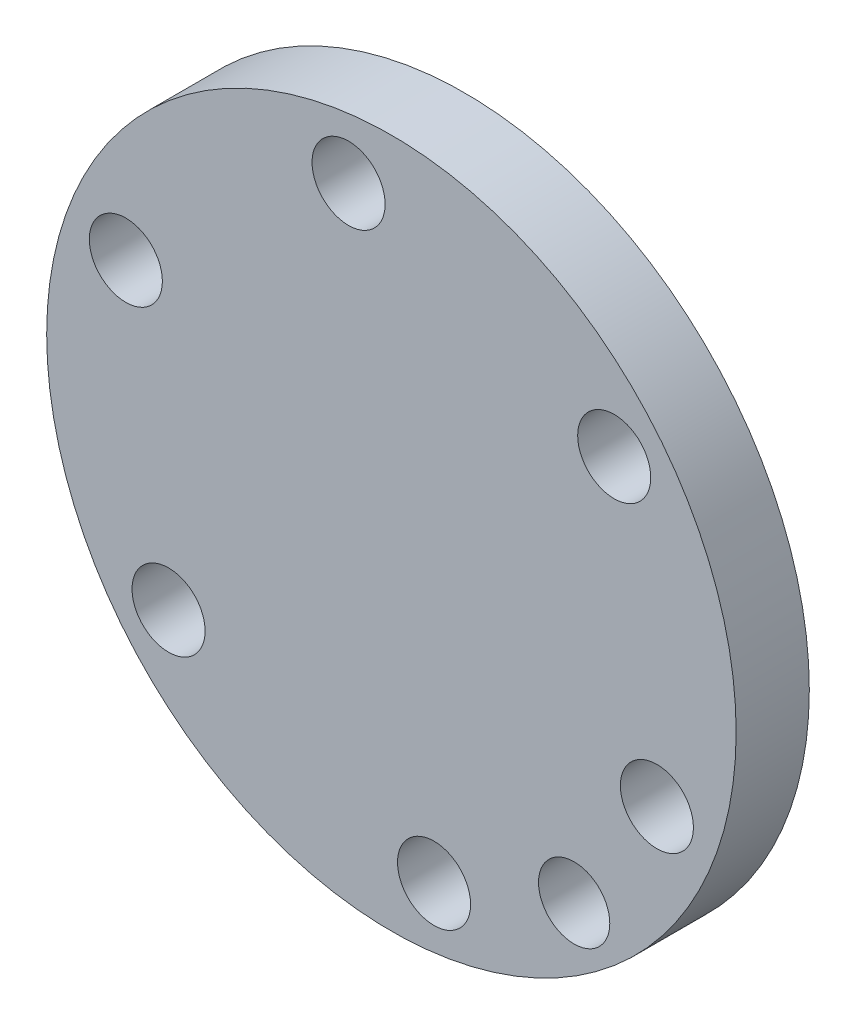
ISO-10303-21;
HEADER;
FILE_DESCRIPTION(('STEP AP214'),'2;1');
FILE_NAME('part.step','',(''),(''),'','','');
FILE_SCHEMA(('AUTOMOTIVE_DESIGN { 1 0 10303 214 1 1 1 1 }'));
ENDSEC;
DATA;
#1=APPLICATION_CONTEXT('core data for automotive mechanical design processes');
#2=APPLICATION_PROTOCOL_DEFINITION('international standard','automotive_design',2000,#1);
#3=PRODUCT_CONTEXT('',#1,'mechanical');
#4=PRODUCT('Part','Part','',(#3));
#5=PRODUCT_RELATED_PRODUCT_CATEGORY('part','',(#4));
#6=PRODUCT_DEFINITION_FORMATION('','',#4);
#7=PRODUCT_DEFINITION_CONTEXT('part definition',#1,'design');
#8=PRODUCT_DEFINITION('design','',#6,#7);
#9=PRODUCT_DEFINITION_SHAPE('','',#8);
#10=(LENGTH_UNIT() NAMED_UNIT(*) SI_UNIT(.MILLI.,.METRE.));
#11=(NAMED_UNIT(*) PLANE_ANGLE_UNIT() SI_UNIT($,.RADIAN.));
#12=(NAMED_UNIT(*) SI_UNIT($,.STERADIAN.) SOLID_ANGLE_UNIT());
#13=UNCERTAINTY_MEASURE_WITH_UNIT(LENGTH_MEASURE(1.E-05),#10,'distance_accuracy_value','');
#14=(GEOMETRIC_REPRESENTATION_CONTEXT(3) GLOBAL_UNCERTAINTY_ASSIGNED_CONTEXT((#13)) GLOBAL_UNIT_ASSIGNED_CONTEXT((#10,
#11,#12)) REPRESENTATION_CONTEXT('',''));
#15=CARTESIAN_POINT('',(0.,0.,0.));
#16=DIRECTION('',(0.,0.,1.));
#17=DIRECTION('',(1.,0.,0.));
#18=AXIS2_PLACEMENT_3D('',#15,#16,#17);
#19=CARTESIAN_POINT('',(22.3808308558776,278.150413141266,0.));
#20=DIRECTION('',(0.,0.,-1.));
#21=DIRECTION('',(-1.,0.,0.));
#22=AXIS2_PLACEMENT_3D('',#19,#20,#21);
#23=PLANE('',#22);
#24=CARTESIAN_POINT('',(22.3808308558776,278.150413141266,0.));
#25=DIRECTION('',(0.,0.,-1.));
#26=DIRECTION('',(-1.,0.,0.));
#27=AXIS2_PLACEMENT_3D('',#24,#25,#26);
#28=CIRCLE('',#27,76.8000000000001);
#29=CARTESIAN_POINT('',(-54.4191691441225,278.150413141266,0.));
#30=VERTEX_POINT('',#29);
#31=EDGE_CURVE('E68',#30,#30,#28,.T.);
#32=ORIENTED_EDGE('',*,*,#31,.F.);
#33=EDGE_LOOP('',(#32));
#34=FACE_BOUND('',#33,.T.);
#35=CARTESIAN_POINT('',(-27.2647840173544,238.487003794824,0.));
#36=DIRECTION('',(0.,0.,-1.));
#37=DIRECTION('',(-1.,0.,0.));
#38=AXIS2_PLACEMENT_3D('',#35,#36,#37);
#39=CIRCLE('',#38,8.1375);
#40=CARTESIAN_POINT('',(-35.4022840173544,238.487003794824,0.));
#41=VERTEX_POINT('',#40);
#42=EDGE_CURVE('E78',#41,#41,#39,.T.);
#43=ORIENTED_EDGE('',*,*,#42,.T.);
#44=EDGE_LOOP('',(#43));
#45=FACE_BOUND('',#44,.T.);
#46=CARTESIAN_POINT('',(31.880563492685,215.334967411074,0.));
#47=DIRECTION('',(0.,0.,-1.));
#48=DIRECTION('',(-1.,0.,0.));
#49=AXIS2_PLACEMENT_3D('',#46,#47,#48);
#50=CIRCLE('',#49,8.13749999999999);
#51=CARTESIAN_POINT('',(23.743063492685,215.334967411074,0.));
#52=VERTEX_POINT('',#51);
#53=EDGE_CURVE('E81',#52,#52,#50,.T.);
#54=ORIENTED_EDGE('',*,*,#53,.T.);
#55=EDGE_LOOP('',(#54));
#56=FACE_BOUND('',#55,.T.);
#57=CARTESIAN_POINT('',(63.0883701991658,227.165480073372,0.));
#58=DIRECTION('',(0.,0.,-1.));
#59=DIRECTION('',(-1.,0.,0.));
#60=AXIS2_PLACEMENT_3D('',#57,#58,#59);
#61=CIRCLE('',#60,7.9375);
#62=CARTESIAN_POINT('',(55.1508701991658,227.165480073372,0.));
#63=VERTEX_POINT('',#62);
#64=EDGE_CURVE('E84',#63,#63,#61,.T.);
#65=ORIENTED_EDGE('',*,*,#64,.T.);
#66=EDGE_LOOP('',(#65));
#67=FACE_BOUND('',#66,.T.);
#68=CARTESIAN_POINT('',(81.5193470873584,254.971228105767,0.));
#69=DIRECTION('',(0.,0.,-1.));
#70=DIRECTION('',(-1.,0.,0.));
#71=AXIS2_PLACEMENT_3D('',#68,#69,#70);
#72=CIRCLE('',#71,8.13749999999999);
#73=CARTESIAN_POINT('',(73.3818470873584,254.971228105767,0.));
#74=VERTEX_POINT('',#73);
#75=EDGE_CURVE('E87',#74,#74,#72,.T.);
#76=ORIENTED_EDGE('',*,*,#75,.T.);
#77=EDGE_LOOP('',(#76));
#78=FACE_BOUND('',#77,.T.);
#79=CARTESIAN_POINT('',(-36.7846201529286,301.218051089699,0.));
#80=DIRECTION('',(0.,0.,-1.));
#81=DIRECTION('',(-1.,0.,0.));
#82=AXIS2_PLACEMENT_3D('',#79,#80,#81);
#83=CIRCLE('',#82,8.13750000000001);
#84=CARTESIAN_POINT('',(-44.9221201529286,301.218051089699,0.));
#85=VERTEX_POINT('',#84);
#86=EDGE_CURVE('E90',#85,#85,#83,.T.);
#87=ORIENTED_EDGE('',*,*,#86,.T.);
#88=EDGE_LOOP('',(#87));
#89=FACE_BOUND('',#88,.T.);
#90=CARTESIAN_POINT('',(12.834949907145,340.867975838614,0.));
#91=DIRECTION('',(0.,0.,-1.));
#92=DIRECTION('',(-1.,0.,0.));
#93=AXIS2_PLACEMENT_3D('',#90,#91,#92);
#94=CIRCLE('',#93,8.13750000000002);
#95=CARTESIAN_POINT('',(4.69744990714503,340.867975838614,0.));
#96=VERTEX_POINT('',#95);
#97=EDGE_CURVE('E93',#96,#96,#94,.T.);
#98=ORIENTED_EDGE('',*,*,#97,.T.);
#99=EDGE_LOOP('',(#98));
#100=FACE_BOUND('',#99,.T.);
#101=CARTESIAN_POINT('',(72.0102436325622,317.734321350223,0.));
#102=DIRECTION('',(0.,0.,-1.));
#103=DIRECTION('',(-1.,0.,0.));
#104=AXIS2_PLACEMENT_3D('',#101,#102,#103);
#105=CIRCLE('',#104,8.13749999999999);
#106=CARTESIAN_POINT('',(63.8727436325622,317.734321350223,0.));
#107=VERTEX_POINT('',#106);
#108=EDGE_CURVE('E76',#107,#107,#105,.T.);
#109=ORIENTED_EDGE('',*,*,#108,.T.);
#110=EDGE_LOOP('',(#109));
#111=FACE_BOUND('',#110,.T.);
#112=ADVANCED_FACE('F37',(#34,#45,#56,#67,#78,#89,#100,#111),#23,.F.);
#113=CARTESIAN_POINT('',(22.3808308558776,278.150413141266,-242.123203180508));
#114=DIRECTION('',(0.,0.,1.));
#115=DIRECTION('',(1.,0.,0.));
#116=AXIS2_PLACEMENT_3D('',#113,#114,#115);
#117=CYLINDRICAL_SURFACE('',#116,76.8000000000001);
#118=CARTESIAN_POINT('',(22.3808308558776,278.150413141266,-16.3));
#119=DIRECTION('',(0.,0.,1.));
#120=DIRECTION('',(1.,0.,0.));
#121=AXIS2_PLACEMENT_3D('',#118,#119,#120);
#122=CIRCLE('',#121,76.8000000000001);
#123=CARTESIAN_POINT('',(99.1808308558778,278.150413141266,-16.3));
#124=VERTEX_POINT('',#123);
#125=EDGE_CURVE('E53',#124,#124,#122,.T.);
#126=ORIENTED_EDGE('',*,*,#125,.T.);
#127=EDGE_LOOP('',(#126));
#128=FACE_BOUND('',#127,.T.);
#129=ORIENTED_EDGE('',*,*,#31,.T.);
#130=EDGE_LOOP('',(#129));
#131=FACE_BOUND('',#130,.T.);
#132=ADVANCED_FACE('F112',(#128,#131),#117,.T.);
#133=CARTESIAN_POINT('',(-27.2647840173544,238.487003794824,-242.123203180508));
#134=DIRECTION('',(0.,0.,1.));
#135=DIRECTION('',(1.,0.,0.));
#136=AXIS2_PLACEMENT_3D('',#133,#134,#135);
#137=CYLINDRICAL_SURFACE('',#136,8.1375);
#138=CARTESIAN_POINT('',(-27.2647840173544,238.487003794824,-16.3));
#139=DIRECTION('',(0.,0.,1.));
#140=DIRECTION('',(1.,0.,0.));
#141=AXIS2_PLACEMENT_3D('',#138,#139,#140);
#142=CIRCLE('',#141,8.1375);
#143=CARTESIAN_POINT('',(-19.1272840173544,238.487003794824,-16.3));
#144=VERTEX_POINT('',#143);
#145=EDGE_CURVE('E10',#144,#144,#142,.T.);
#146=ORIENTED_EDGE('',*,*,#145,.F.);
#147=EDGE_LOOP('',(#146));
#148=FACE_BOUND('',#147,.T.);
#149=ORIENTED_EDGE('',*,*,#42,.F.);
#150=EDGE_LOOP('',(#149));
#151=FACE_BOUND('',#150,.T.);
#152=ADVANCED_FACE('F119',(#148,#151),#137,.F.);
#153=CARTESIAN_POINT('',(31.880563492685,215.334967411074,-242.123203180508));
#154=DIRECTION('',(0.,0.,1.));
#155=DIRECTION('',(1.,0.,0.));
#156=AXIS2_PLACEMENT_3D('',#153,#154,#155);
#157=CYLINDRICAL_SURFACE('',#156,8.13749999999999);
#158=CARTESIAN_POINT('',(31.880563492685,215.334967411074,-16.3));
#159=DIRECTION('',(0.,0.,1.));
#160=DIRECTION('',(1.,0.,0.));
#161=AXIS2_PLACEMENT_3D('',#158,#159,#160);
#162=CIRCLE('',#161,8.13749999999999);
#163=CARTESIAN_POINT('',(40.018063492685,215.334967411074,-16.3));
#164=VERTEX_POINT('',#163);
#165=EDGE_CURVE('E45',#164,#164,#162,.T.);
#166=ORIENTED_EDGE('',*,*,#165,.F.);
#167=EDGE_LOOP('',(#166));
#168=FACE_BOUND('',#167,.T.);
#169=ORIENTED_EDGE('',*,*,#53,.F.);
#170=EDGE_LOOP('',(#169));
#171=FACE_BOUND('',#170,.T.);
#172=ADVANCED_FACE('F131',(#168,#171),#157,.F.);
#173=CARTESIAN_POINT('',(63.0883701991658,227.165480073372,-242.123203180508));
#174=DIRECTION('',(0.,0.,1.));
#175=DIRECTION('',(1.,0.,0.));
#176=AXIS2_PLACEMENT_3D('',#173,#174,#175);
#177=CYLINDRICAL_SURFACE('',#176,7.9375);
#178=CARTESIAN_POINT('',(63.0883701991658,227.165480073372,-16.3));
#179=DIRECTION('',(0.,0.,1.));
#180=DIRECTION('',(1.,0.,0.));
#181=AXIS2_PLACEMENT_3D('',#178,#179,#180);
#182=CIRCLE('',#181,7.9375);
#183=CARTESIAN_POINT('',(71.0258701991658,227.165480073372,-16.3));
#184=VERTEX_POINT('',#183);
#185=EDGE_CURVE('E50',#184,#184,#182,.T.);
#186=ORIENTED_EDGE('',*,*,#185,.F.);
#187=EDGE_LOOP('',(#186));
#188=FACE_BOUND('',#187,.T.);
#189=ORIENTED_EDGE('',*,*,#64,.F.);
#190=EDGE_LOOP('',(#189));
#191=FACE_BOUND('',#190,.T.);
#192=ADVANCED_FACE('F128',(#188,#191),#177,.F.);
#193=CARTESIAN_POINT('',(81.5193470873584,254.971228105767,-242.123203180508));
#194=DIRECTION('',(0.,0.,1.));
#195=DIRECTION('',(1.,0.,0.));
#196=AXIS2_PLACEMENT_3D('',#193,#194,#195);
#197=CYLINDRICAL_SURFACE('',#196,8.13749999999999);
#198=CARTESIAN_POINT('',(81.5193470873584,254.971228105767,-16.3));
#199=DIRECTION('',(0.,0.,1.));
#200=DIRECTION('',(1.,0.,0.));
#201=AXIS2_PLACEMENT_3D('',#198,#199,#200);
#202=CIRCLE('',#201,8.13749999999999);
#203=CARTESIAN_POINT('',(89.6568470873584,254.971228105767,-16.3));
#204=VERTEX_POINT('',#203);
#205=EDGE_CURVE('E58',#204,#204,#202,.T.);
#206=ORIENTED_EDGE('',*,*,#205,.F.);
#207=EDGE_LOOP('',(#206));
#208=FACE_BOUND('',#207,.T.);
#209=ORIENTED_EDGE('',*,*,#75,.F.);
#210=EDGE_LOOP('',(#209));
#211=FACE_BOUND('',#210,.T.);
#212=ADVANCED_FACE('F126',(#208,#211),#197,.F.);
#213=CARTESIAN_POINT('',(-36.7846201529286,301.218051089699,-242.123203180508));
#214=DIRECTION('',(0.,0.,1.));
#215=DIRECTION('',(1.,0.,0.));
#216=AXIS2_PLACEMENT_3D('',#213,#214,#215);
#217=CYLINDRICAL_SURFACE('',#216,8.13750000000001);
#218=CARTESIAN_POINT('',(-36.7846201529286,301.218051089699,-16.3));
#219=DIRECTION('',(0.,0.,1.));
#220=DIRECTION('',(1.,0.,0.));
#221=AXIS2_PLACEMENT_3D('',#218,#219,#220);
#222=CIRCLE('',#221,8.13750000000001);
#223=CARTESIAN_POINT('',(-28.6471201529286,301.218051089699,-16.3));
#224=VERTEX_POINT('',#223);
#225=EDGE_CURVE('E61',#224,#224,#222,.T.);
#226=ORIENTED_EDGE('',*,*,#225,.F.);
#227=EDGE_LOOP('',(#226));
#228=FACE_BOUND('',#227,.T.);
#229=ORIENTED_EDGE('',*,*,#86,.F.);
#230=EDGE_LOOP('',(#229));
#231=FACE_BOUND('',#230,.T.);
#232=ADVANCED_FACE('F108',(#228,#231),#217,.F.);
#233=CARTESIAN_POINT('',(12.834949907145,340.867975838614,-242.123203180508));
#234=DIRECTION('',(0.,0.,1.));
#235=DIRECTION('',(1.,0.,0.));
#236=AXIS2_PLACEMENT_3D('',#233,#234,#235);
#237=CYLINDRICAL_SURFACE('',#236,8.13750000000002);
#238=CARTESIAN_POINT('',(12.834949907145,340.867975838614,-16.3));
#239=DIRECTION('',(0.,0.,1.));
#240=DIRECTION('',(1.,0.,0.));
#241=AXIS2_PLACEMENT_3D('',#238,#239,#240);
#242=CIRCLE('',#241,8.13750000000002);
#243=CARTESIAN_POINT('',(20.9724499071451,340.867975838614,-16.3));
#244=VERTEX_POINT('',#243);
#245=EDGE_CURVE('E63',#244,#244,#242,.T.);
#246=ORIENTED_EDGE('',*,*,#245,.F.);
#247=EDGE_LOOP('',(#246));
#248=FACE_BOUND('',#247,.T.);
#249=ORIENTED_EDGE('',*,*,#97,.F.);
#250=EDGE_LOOP('',(#249));
#251=FACE_BOUND('',#250,.T.);
#252=ADVANCED_FACE('F101',(#248,#251),#237,.F.);
#253=CARTESIAN_POINT('',(72.0102436325622,317.734321350223,-242.123203180508));
#254=DIRECTION('',(0.,0.,1.));
#255=DIRECTION('',(1.,0.,0.));
#256=AXIS2_PLACEMENT_3D('',#253,#254,#255);
#257=CYLINDRICAL_SURFACE('',#256,8.13749999999999);
#258=CARTESIAN_POINT('',(72.0102436325622,317.734321350223,-16.3));
#259=DIRECTION('',(0.,0.,1.));
#260=DIRECTION('',(1.,0.,0.));
#261=AXIS2_PLACEMENT_3D('',#258,#259,#260);
#262=CIRCLE('',#261,8.13749999999999);
#263=CARTESIAN_POINT('',(80.1477436325622,317.734321350223,-16.3));
#264=VERTEX_POINT('',#263);
#265=EDGE_CURVE('E41',#264,#264,#262,.T.);
#266=ORIENTED_EDGE('',*,*,#265,.F.);
#267=EDGE_LOOP('',(#266));
#268=FACE_BOUND('',#267,.T.);
#269=ORIENTED_EDGE('',*,*,#108,.F.);
#270=EDGE_LOOP('',(#269));
#271=FACE_BOUND('',#270,.T.);
#272=ADVANCED_FACE('F99',(#268,#271),#257,.F.);
#273=CARTESIAN_POINT('',(22.3808308558776,278.150413141266,-16.3));
#274=DIRECTION('',(0.,0.,1.));
#275=DIRECTION('',(1.,0.,0.));
#276=AXIS2_PLACEMENT_3D('',#273,#274,#275);
#277=PLANE('',#276);
#278=ORIENTED_EDGE('',*,*,#265,.T.);
#279=EDGE_LOOP('',(#278));
#280=FACE_BOUND('',#279,.T.);
#281=ORIENTED_EDGE('',*,*,#245,.T.);
#282=EDGE_LOOP('',(#281));
#283=FACE_BOUND('',#282,.T.);
#284=ORIENTED_EDGE('',*,*,#225,.T.);
#285=EDGE_LOOP('',(#284));
#286=FACE_BOUND('',#285,.T.);
#287=ORIENTED_EDGE('',*,*,#205,.T.);
#288=EDGE_LOOP('',(#287));
#289=FACE_BOUND('',#288,.T.);
#290=ORIENTED_EDGE('',*,*,#185,.T.);
#291=EDGE_LOOP('',(#290));
#292=FACE_BOUND('',#291,.T.);
#293=ORIENTED_EDGE('',*,*,#165,.T.);
#294=EDGE_LOOP('',(#293));
#295=FACE_BOUND('',#294,.T.);
#296=ORIENTED_EDGE('',*,*,#145,.T.);
#297=EDGE_LOOP('',(#296));
#298=FACE_BOUND('',#297,.T.);
#299=ORIENTED_EDGE('',*,*,#125,.F.);
#300=EDGE_LOOP('',(#299));
#301=FACE_BOUND('',#300,.T.);
#302=ADVANCED_FACE('F39',(#280,#283,#286,#289,#292,#295,#298,#301),#277,.F.);
#303=CLOSED_SHELL('',(#112,#132,#152,#172,#192,#212,#232,#252,#272,#302));
#304=MANIFOLD_SOLID_BREP('B2',#303);
#305=ADVANCED_BREP_SHAPE_REPRESENTATION('',(#18,#304),#14);
#306=SHAPE_DEFINITION_REPRESENTATION(#9,#305);
ENDSEC;
END-ISO-10303-21;
